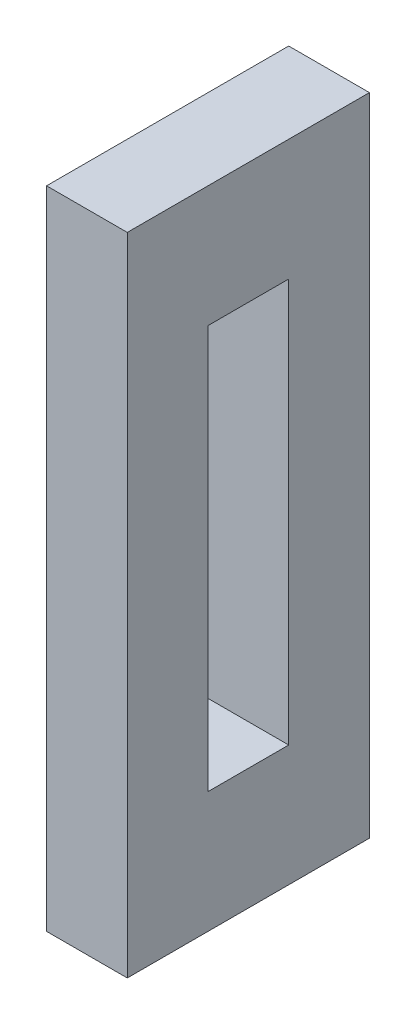
ISO-10303-21;
HEADER;
FILE_DESCRIPTION(('STEP AP214'),'2;1');
FILE_NAME('part.step','',(''),(''),'','','');
FILE_SCHEMA(('AUTOMOTIVE_DESIGN { 1 0 10303 214 1 1 1 1 }'));
ENDSEC;
DATA;
#1=APPLICATION_CONTEXT('core data for automotive mechanical design processes');
#2=APPLICATION_PROTOCOL_DEFINITION('international standard','automotive_design',2000,#1);
#3=PRODUCT_CONTEXT('',#1,'mechanical');
#4=PRODUCT('Part','Part','',(#3));
#5=PRODUCT_RELATED_PRODUCT_CATEGORY('part','',(#4));
#6=PRODUCT_DEFINITION_FORMATION('','',#4);
#7=PRODUCT_DEFINITION_CONTEXT('part definition',#1,'design');
#8=PRODUCT_DEFINITION('design','',#6,#7);
#9=PRODUCT_DEFINITION_SHAPE('','',#8);
#10=(LENGTH_UNIT() NAMED_UNIT(*) SI_UNIT(.MILLI.,.METRE.));
#11=(NAMED_UNIT(*) PLANE_ANGLE_UNIT() SI_UNIT($,.RADIAN.));
#12=(NAMED_UNIT(*) SI_UNIT($,.STERADIAN.) SOLID_ANGLE_UNIT());
#13=UNCERTAINTY_MEASURE_WITH_UNIT(LENGTH_MEASURE(1.E-05),#10,'distance_accuracy_value','');
#14=(GEOMETRIC_REPRESENTATION_CONTEXT(3) GLOBAL_UNCERTAINTY_ASSIGNED_CONTEXT((#13)) GLOBAL_UNIT_ASSIGNED_CONTEXT((#10,
#11,#12)) REPRESENTATION_CONTEXT('',''));
#15=CARTESIAN_POINT('',(0.,0.,0.));
#16=DIRECTION('',(0.,0.,1.));
#17=DIRECTION('',(1.,0.,0.));
#18=AXIS2_PLACEMENT_3D('',#15,#16,#17);
#19=CARTESIAN_POINT('',(10.,0.,0.));
#20=DIRECTION('',(-1.,0.,0.));
#21=DIRECTION('',(0.,0.,1.));
#22=AXIS2_PLACEMENT_3D('',#19,#20,#21);
#23=PLANE('',#22);
#24=DIRECTION('',(0.,0.,-1.));
#25=VECTOR('',#24,1.);
#26=CARTESIAN_POINT('',(10.,-40.,15.));
#27=LINE('',#26,#25);
#28=CARTESIAN_POINT('',(10.,-40.,15.));
#29=VERTEX_POINT('',#28);
#30=CARTESIAN_POINT('',(10.,-40.,-15.));
#31=VERTEX_POINT('',#30);
#32=EDGE_CURVE('E133',#29,#31,#27,.T.);
#33=ORIENTED_EDGE('',*,*,#32,.T.);
#34=DIRECTION('',(0.,1.,0.));
#35=VECTOR('',#34,1.);
#36=CARTESIAN_POINT('',(10.,40.,-15.));
#37=LINE('',#36,#35);
#38=CARTESIAN_POINT('',(10.,40.,-15.));
#39=VERTEX_POINT('',#38);
#40=EDGE_CURVE('E136',#31,#39,#37,.T.);
#41=ORIENTED_EDGE('',*,*,#40,.T.);
#42=DIRECTION('',(0.,0.,1.));
#43=VECTOR('',#42,1.);
#44=CARTESIAN_POINT('',(10.,40.,15.));
#45=LINE('',#44,#43);
#46=CARTESIAN_POINT('',(10.,40.,15.));
#47=VERTEX_POINT('',#46);
#48=EDGE_CURVE('E139',#39,#47,#45,.T.);
#49=ORIENTED_EDGE('',*,*,#48,.T.);
#50=DIRECTION('',(0.,-1.,0.));
#51=VECTOR('',#50,1.);
#52=CARTESIAN_POINT('',(10.,40.,15.));
#53=LINE('',#52,#51);
#54=EDGE_CURVE('E141',#47,#29,#53,.T.);
#55=ORIENTED_EDGE('',*,*,#54,.T.);
#56=EDGE_LOOP('',(#33,#41,#49,#55));
#57=FACE_BOUND('',#56,.T.);
#58=DIRECTION('',(0.,0.,-1.));
#59=VECTOR('',#58,1.);
#60=CARTESIAN_POINT('',(10.,-25.,-5.00000000000001));
#61=LINE('',#60,#59);
#62=CARTESIAN_POINT('',(10.,-25.,4.99999999999999));
#63=VERTEX_POINT('',#62);
#64=CARTESIAN_POINT('',(10.,-25.,-5.00000000000001));
#65=VERTEX_POINT('',#64);
#66=EDGE_CURVE('E97',#63,#65,#61,.T.);
#67=ORIENTED_EDGE('',*,*,#66,.F.);
#68=DIRECTION('',(0.,-1.,0.));
#69=VECTOR('',#68,1.);
#70=CARTESIAN_POINT('',(10.,25.,4.99999999999999));
#71=LINE('',#70,#69);
#72=CARTESIAN_POINT('',(10.,25.,4.99999999999999));
#73=VERTEX_POINT('',#72);
#74=EDGE_CURVE('E119',#73,#63,#71,.T.);
#75=ORIENTED_EDGE('',*,*,#74,.F.);
#76=DIRECTION('',(0.,0.,1.));
#77=VECTOR('',#76,1.);
#78=CARTESIAN_POINT('',(10.,25.,-5.00000000000001));
#79=LINE('',#78,#77);
#80=CARTESIAN_POINT('',(10.,25.,-5.00000000000001));
#81=VERTEX_POINT('',#80);
#82=EDGE_CURVE('E117',#81,#73,#79,.T.);
#83=ORIENTED_EDGE('',*,*,#82,.F.);
#84=DIRECTION('',(0.,1.,0.));
#85=VECTOR('',#84,1.);
#86=CARTESIAN_POINT('',(10.,25.,-5.00000000000001));
#87=LINE('',#86,#85);
#88=EDGE_CURVE('E105',#65,#81,#87,.T.);
#89=ORIENTED_EDGE('',*,*,#88,.F.);
#90=EDGE_LOOP('',(#67,#75,#83,#89));
#91=FACE_BOUND('',#90,.T.);
#92=ADVANCED_FACE('F32',(#57,#91),#23,.F.);
#93=CARTESIAN_POINT('',(0.,0.,0.));
#94=DIRECTION('',(-1.,0.,0.));
#95=DIRECTION('',(0.,0.,1.));
#96=AXIS2_PLACEMENT_3D('',#93,#94,#95);
#97=PLANE('',#96);
#98=DIRECTION('',(0.,0.,-1.));
#99=VECTOR('',#98,1.);
#100=CARTESIAN_POINT('',(0.,-40.,15.));
#101=LINE('',#100,#99);
#102=CARTESIAN_POINT('',(0.,-40.,15.));
#103=VERTEX_POINT('',#102);
#104=CARTESIAN_POINT('',(0.,-40.,-15.));
#105=VERTEX_POINT('',#104);
#106=EDGE_CURVE('E113',#103,#105,#101,.T.);
#107=ORIENTED_EDGE('',*,*,#106,.F.);
#108=DIRECTION('',(0.,-1.,0.));
#109=VECTOR('',#108,1.);
#110=CARTESIAN_POINT('',(0.,40.,15.));
#111=LINE('',#110,#109);
#112=CARTESIAN_POINT('',(0.,40.,15.));
#113=VERTEX_POINT('',#112);
#114=EDGE_CURVE('E137',#113,#103,#111,.T.);
#115=ORIENTED_EDGE('',*,*,#114,.F.);
#116=DIRECTION('',(0.,0.,1.));
#117=VECTOR('',#116,1.);
#118=CARTESIAN_POINT('',(0.,40.,15.));
#119=LINE('',#118,#117);
#120=CARTESIAN_POINT('',(0.,40.,-15.));
#121=VERTEX_POINT('',#120);
#122=EDGE_CURVE('E148',#121,#113,#119,.T.);
#123=ORIENTED_EDGE('',*,*,#122,.F.);
#124=DIRECTION('',(0.,1.,0.));
#125=VECTOR('',#124,1.);
#126=CARTESIAN_POINT('',(0.,40.,-15.));
#127=LINE('',#126,#125);
#128=EDGE_CURVE('E146',#105,#121,#127,.T.);
#129=ORIENTED_EDGE('',*,*,#128,.F.);
#130=EDGE_LOOP('',(#107,#115,#123,#129));
#131=FACE_BOUND('',#130,.T.);
#132=DIRECTION('',(0.,-1.,0.));
#133=VECTOR('',#132,1.);
#134=CARTESIAN_POINT('',(0.,25.,4.99999999999999));
#135=LINE('',#134,#133);
#136=CARTESIAN_POINT('',(0.,25.,4.99999999999999));
#137=VERTEX_POINT('',#136);
#138=CARTESIAN_POINT('',(0.,-25.,4.99999999999999));
#139=VERTEX_POINT('',#138);
#140=EDGE_CURVE('E106',#137,#139,#135,.T.);
#141=ORIENTED_EDGE('',*,*,#140,.T.);
#142=DIRECTION('',(0.,0.,-1.));
#143=VECTOR('',#142,1.);
#144=CARTESIAN_POINT('',(0.,-25.,-5.00000000000001));
#145=LINE('',#144,#143);
#146=CARTESIAN_POINT('',(0.,-25.,-5.00000000000001));
#147=VERTEX_POINT('',#146);
#148=EDGE_CURVE('E55',#139,#147,#145,.T.);
#149=ORIENTED_EDGE('',*,*,#148,.T.);
#150=DIRECTION('',(0.,1.,0.));
#151=VECTOR('',#150,1.);
#152=CARTESIAN_POINT('',(0.,25.,-5.00000000000001));
#153=LINE('',#152,#151);
#154=CARTESIAN_POINT('',(0.,25.,-5.00000000000001));
#155=VERTEX_POINT('',#154);
#156=EDGE_CURVE('E112',#147,#155,#153,.T.);
#157=ORIENTED_EDGE('',*,*,#156,.T.);
#158=DIRECTION('',(0.,0.,1.));
#159=VECTOR('',#158,1.);
#160=CARTESIAN_POINT('',(0.,25.,-5.00000000000001));
#161=LINE('',#160,#159);
#162=EDGE_CURVE('E125',#155,#137,#161,.T.);
#163=ORIENTED_EDGE('',*,*,#162,.T.);
#164=EDGE_LOOP('',(#141,#149,#157,#163));
#165=FACE_BOUND('',#164,.T.);
#166=ADVANCED_FACE('F166',(#131,#165),#97,.T.);
#167=CARTESIAN_POINT('',(10.,-40.,15.));
#168=DIRECTION('',(0.,1.,0.));
#169=DIRECTION('',(0.,0.,1.));
#170=AXIS2_PLACEMENT_3D('',#167,#168,#169);
#171=PLANE('',#170);
#172=ORIENTED_EDGE('',*,*,#106,.T.);
#173=DIRECTION('',(-1.,0.,0.));
#174=VECTOR('',#173,1.);
#175=CARTESIAN_POINT('',(10.,-40.,-15.));
#176=LINE('',#175,#174);
#177=EDGE_CURVE('E11',#31,#105,#176,.T.);
#178=ORIENTED_EDGE('',*,*,#177,.F.);
#179=ORIENTED_EDGE('',*,*,#32,.F.);
#180=DIRECTION('',(-1.,0.,0.));
#181=VECTOR('',#180,1.);
#182=CARTESIAN_POINT('',(10.,-40.,15.));
#183=LINE('',#182,#181);
#184=EDGE_CURVE('E143',#29,#103,#183,.T.);
#185=ORIENTED_EDGE('',*,*,#184,.T.);
#186=EDGE_LOOP('',(#172,#178,#179,#185));
#187=FACE_BOUND('',#186,.T.);
#188=ADVANCED_FACE('F34',(#187),#171,.F.);
#189=CARTESIAN_POINT('',(10.,40.,-15.));
#190=DIRECTION('',(0.,0.,1.));
#191=DIRECTION('',(1.,0.,0.));
#192=AXIS2_PLACEMENT_3D('',#189,#190,#191);
#193=PLANE('',#192);
#194=ORIENTED_EDGE('',*,*,#128,.T.);
#195=DIRECTION('',(-1.,0.,0.));
#196=VECTOR('',#195,1.);
#197=CARTESIAN_POINT('',(10.,40.,-15.));
#198=LINE('',#197,#196);
#199=EDGE_CURVE('E40',#39,#121,#198,.T.);
#200=ORIENTED_EDGE('',*,*,#199,.F.);
#201=ORIENTED_EDGE('',*,*,#40,.F.);
#202=ORIENTED_EDGE('',*,*,#177,.T.);
#203=EDGE_LOOP('',(#194,#200,#201,#202));
#204=FACE_BOUND('',#203,.T.);
#205=ADVANCED_FACE('F176',(#204),#193,.F.);
#206=CARTESIAN_POINT('',(10.,40.,15.));
#207=DIRECTION('',(0.,-1.,0.));
#208=DIRECTION('',(0.,0.,-1.));
#209=AXIS2_PLACEMENT_3D('',#206,#207,#208);
#210=PLANE('',#209);
#211=ORIENTED_EDGE('',*,*,#122,.T.);
#212=DIRECTION('',(-1.,0.,0.));
#213=VECTOR('',#212,1.);
#214=CARTESIAN_POINT('',(10.,40.,15.));
#215=LINE('',#214,#213);
#216=EDGE_CURVE('E153',#47,#113,#215,.T.);
#217=ORIENTED_EDGE('',*,*,#216,.F.);
#218=ORIENTED_EDGE('',*,*,#48,.F.);
#219=ORIENTED_EDGE('',*,*,#199,.T.);
#220=EDGE_LOOP('',(#211,#217,#218,#219));
#221=FACE_BOUND('',#220,.T.);
#222=ADVANCED_FACE('F160',(#221),#210,.F.);
#223=CARTESIAN_POINT('',(10.,40.,15.));
#224=DIRECTION('',(0.,0.,-1.));
#225=DIRECTION('',(-1.,0.,0.));
#226=AXIS2_PLACEMENT_3D('',#223,#224,#225);
#227=PLANE('',#226);
#228=ORIENTED_EDGE('',*,*,#114,.T.);
#229=ORIENTED_EDGE('',*,*,#184,.F.);
#230=ORIENTED_EDGE('',*,*,#54,.F.);
#231=ORIENTED_EDGE('',*,*,#216,.T.);
#232=EDGE_LOOP('',(#228,#229,#230,#231));
#233=FACE_BOUND('',#232,.T.);
#234=ADVANCED_FACE('F170',(#233),#227,.F.);
#235=CARTESIAN_POINT('',(10.,-25.,-5.00000000000001));
#236=DIRECTION('',(0.,1.,0.));
#237=DIRECTION('',(0.,0.,1.));
#238=AXIS2_PLACEMENT_3D('',#235,#236,#237);
#239=PLANE('',#238);
#240=ORIENTED_EDGE('',*,*,#148,.F.);
#241=DIRECTION('',(-1.,0.,0.));
#242=VECTOR('',#241,1.);
#243=CARTESIAN_POINT('',(10.,-25.,4.99999999999999));
#244=LINE('',#243,#242);
#245=EDGE_CURVE('E101',#63,#139,#244,.T.);
#246=ORIENTED_EDGE('',*,*,#245,.F.);
#247=ORIENTED_EDGE('',*,*,#66,.T.);
#248=DIRECTION('',(-1.,0.,0.));
#249=VECTOR('',#248,1.);
#250=CARTESIAN_POINT('',(10.,-25.,-5.00000000000001));
#251=LINE('',#250,#249);
#252=EDGE_CURVE('E100',#65,#147,#251,.T.);
#253=ORIENTED_EDGE('',*,*,#252,.T.);
#254=EDGE_LOOP('',(#240,#246,#247,#253));
#255=FACE_BOUND('',#254,.T.);
#256=ADVANCED_FACE('F99',(#255),#239,.T.);
#257=CARTESIAN_POINT('',(10.,25.,-5.00000000000001));
#258=DIRECTION('',(0.,0.,1.));
#259=DIRECTION('',(0.,-1.,0.));
#260=AXIS2_PLACEMENT_3D('',#257,#258,#259);
#261=PLANE('',#260);
#262=ORIENTED_EDGE('',*,*,#156,.F.);
#263=ORIENTED_EDGE('',*,*,#252,.F.);
#264=ORIENTED_EDGE('',*,*,#88,.T.);
#265=DIRECTION('',(-1.,0.,0.));
#266=VECTOR('',#265,1.);
#267=CARTESIAN_POINT('',(10.,25.,-5.00000000000001));
#268=LINE('',#267,#266);
#269=EDGE_CURVE('E114',#81,#155,#268,.T.);
#270=ORIENTED_EDGE('',*,*,#269,.T.);
#271=EDGE_LOOP('',(#262,#263,#264,#270));
#272=FACE_BOUND('',#271,.T.);
#273=ADVANCED_FACE('F109',(#272),#261,.T.);
#274=CARTESIAN_POINT('',(10.,25.,-5.00000000000001));
#275=DIRECTION('',(0.,-1.,0.));
#276=DIRECTION('',(0.,0.,-1.));
#277=AXIS2_PLACEMENT_3D('',#274,#275,#276);
#278=PLANE('',#277);
#279=ORIENTED_EDGE('',*,*,#162,.F.);
#280=ORIENTED_EDGE('',*,*,#269,.F.);
#281=ORIENTED_EDGE('',*,*,#82,.T.);
#282=DIRECTION('',(-1.,0.,0.));
#283=VECTOR('',#282,1.);
#284=CARTESIAN_POINT('',(10.,25.,4.99999999999999));
#285=LINE('',#284,#283);
#286=EDGE_CURVE('E47',#73,#137,#285,.T.);
#287=ORIENTED_EDGE('',*,*,#286,.T.);
#288=EDGE_LOOP('',(#279,#280,#281,#287));
#289=FACE_BOUND('',#288,.T.);
#290=ADVANCED_FACE('F199',(#289),#278,.T.);
#291=CARTESIAN_POINT('',(10.,25.,4.99999999999999));
#292=DIRECTION('',(0.,0.,-1.));
#293=DIRECTION('',(-1.,0.,0.));
#294=AXIS2_PLACEMENT_3D('',#291,#292,#293);
#295=PLANE('',#294);
#296=ORIENTED_EDGE('',*,*,#140,.F.);
#297=ORIENTED_EDGE('',*,*,#286,.F.);
#298=ORIENTED_EDGE('',*,*,#74,.T.);
#299=ORIENTED_EDGE('',*,*,#245,.T.);
#300=EDGE_LOOP('',(#296,#297,#298,#299));
#301=FACE_BOUND('',#300,.T.);
#302=ADVANCED_FACE('F203',(#301),#295,.T.);
#303=CLOSED_SHELL('',(#92,#166,#188,#205,#222,#234,#256,#273,#290,#302));
#304=MANIFOLD_SOLID_BREP('B2',#303);
#305=ADVANCED_BREP_SHAPE_REPRESENTATION('',(#18,#304),#14);
#306=SHAPE_DEFINITION_REPRESENTATION(#9,#305);
ENDSEC;
END-ISO-10303-21;
